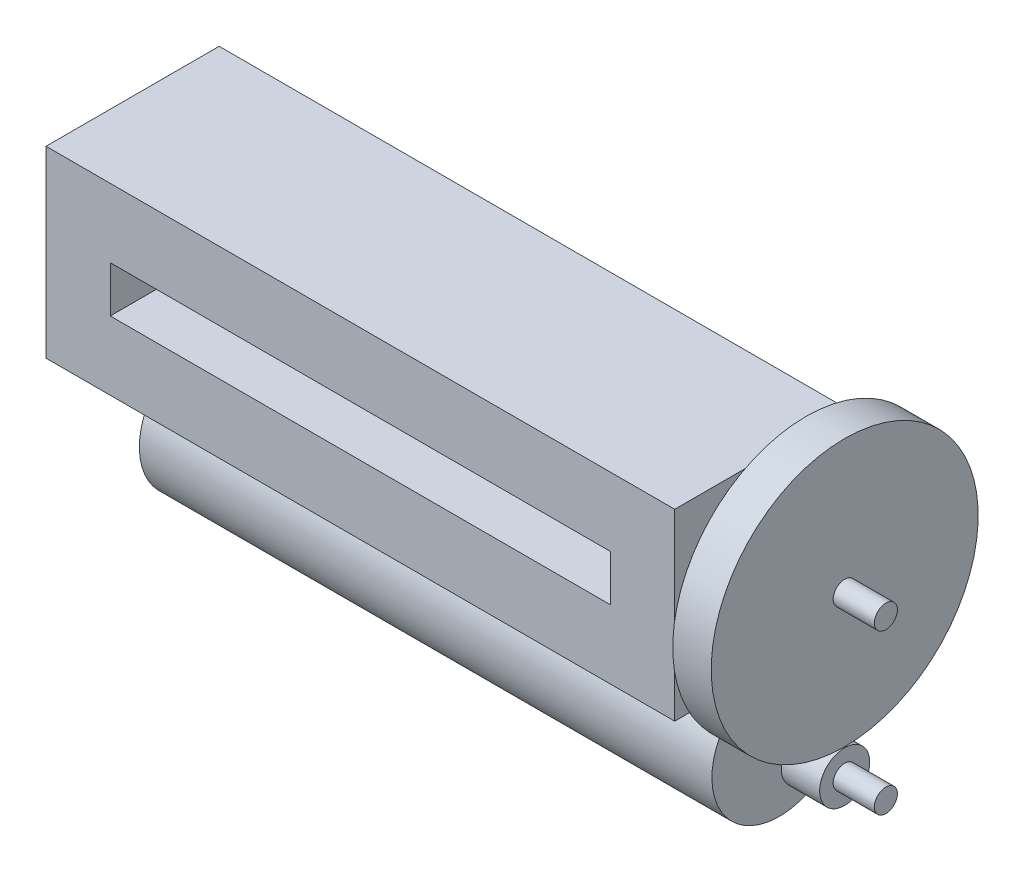
ISO-10303-21;
HEADER;
FILE_DESCRIPTION(('STEP AP214'),'2;1');
FILE_NAME('part.step','',(''),(''),'','','');
FILE_SCHEMA(('AUTOMOTIVE_DESIGN { 1 0 10303 214 1 1 1 1 }'));
ENDSEC;
DATA;
#1=APPLICATION_CONTEXT('core data for automotive mechanical design processes');
#2=APPLICATION_PROTOCOL_DEFINITION('international standard','automotive_design',2000,#1);
#3=PRODUCT_CONTEXT('',#1,'mechanical');
#4=PRODUCT('Part','Part','',(#3));
#5=PRODUCT_RELATED_PRODUCT_CATEGORY('part','',(#4));
#6=PRODUCT_DEFINITION_FORMATION('','',#4);
#7=PRODUCT_DEFINITION_CONTEXT('part definition',#1,'design');
#8=PRODUCT_DEFINITION('design','',#6,#7);
#9=PRODUCT_DEFINITION_SHAPE('','',#8);
#10=(LENGTH_UNIT() NAMED_UNIT(*) SI_UNIT(.MILLI.,.METRE.));
#11=(NAMED_UNIT(*) PLANE_ANGLE_UNIT() SI_UNIT($,.RADIAN.));
#12=(NAMED_UNIT(*) SI_UNIT($,.STERADIAN.) SOLID_ANGLE_UNIT());
#13=UNCERTAINTY_MEASURE_WITH_UNIT(LENGTH_MEASURE(1.E-05),#10,'distance_accuracy_value','');
#14=(GEOMETRIC_REPRESENTATION_CONTEXT(3) GLOBAL_UNCERTAINTY_ASSIGNED_CONTEXT((#13)) GLOBAL_UNIT_ASSIGNED_CONTEXT((#10,
#11,#12)) REPRESENTATION_CONTEXT('',''));
#15=CARTESIAN_POINT('',(0.,0.,0.));
#16=DIRECTION('',(0.,0.,1.));
#17=DIRECTION('',(1.,0.,0.));
#18=AXIS2_PLACEMENT_3D('',#15,#16,#17);
#19=CARTESIAN_POINT('',(-3.73,-14.1336074618737,3.05881386109098));
#20=DIRECTION('',(1.,0.,0.));
#21=DIRECTION('',(0.,1.,0.));
#22=AXIS2_PLACEMENT_3D('',#19,#20,#21);
#23=PLANE('',#22);
#24=CARTESIAN_POINT('',(-3.73,-13.8300074618737,3.36241386109098));
#25=DIRECTION('',(-1.,0.,0.));
#26=DIRECTION('',(0.,0.,1.));
#27=AXIS2_PLACEMENT_3D('',#24,#25,#26);
#28=CIRCLE('',#27,0.3);
#29=CARTESIAN_POINT('',(-3.73,-13.8300074618737,3.66241386109098));
#30=VERTEX_POINT('',#29);
#31=EDGE_CURVE('P0_E18',#30,#30,#28,.T.);
#32=ORIENTED_EDGE('',*,*,#31,.F.);
#33=EDGE_LOOP('',(#32));
#34=FACE_BOUND('',#33,.T.);
#35=ADVANCED_FACE('P0_F15',(#34),#23,.T.);
#36=CARTESIAN_POINT('',(-4.8,-13.8300074618737,3.36241386109098));
#37=DIRECTION('',(-1.,0.,0.));
#38=DIRECTION('',(0.,0.,1.));
#39=AXIS2_PLACEMENT_3D('',#36,#37,#38);
#40=CYLINDRICAL_SURFACE('',#39,0.3);
#41=CARTESIAN_POINT('',(-4.8,-13.8300074618737,3.36241386109098));
#42=DIRECTION('',(-1.,0.,0.));
#43=DIRECTION('',(0.,0.,1.));
#44=AXIS2_PLACEMENT_3D('',#41,#42,#43);
#45=CIRCLE('',#44,0.3);
#46=CARTESIAN_POINT('',(-4.8,-13.8300074618737,3.66241386109098));
#47=VERTEX_POINT('',#46);
#48=EDGE_CURVE('P0_E40',#47,#47,#45,.T.);
#49=ORIENTED_EDGE('',*,*,#48,.F.);
#50=EDGE_LOOP('',(#49));
#51=FACE_BOUND('',#50,.T.);
#52=ORIENTED_EDGE('',*,*,#31,.T.);
#53=EDGE_LOOP('',(#52));
#54=FACE_BOUND('',#53,.T.);
#55=ADVANCED_FACE('P0_F47',(#51,#54),#40,.T.);
#56=CARTESIAN_POINT('',(-4.8,-14.4878074618737,2.70461386109097));
#57=DIRECTION('',(1.,0.,0.));
#58=DIRECTION('',(0.,1.,0.));
#59=AXIS2_PLACEMENT_3D('',#56,#57,#58);
#60=PLANE('',#59);
#61=ORIENTED_EDGE('',*,*,#48,.T.);
#62=EDGE_LOOP('',(#61));
#63=FACE_BOUND('',#62,.T.);
#64=CARTESIAN_POINT('',(-4.8,-13.8300074618737,3.36241386109098));
#65=DIRECTION('',(1.,0.,0.));
#66=DIRECTION('',(0.,0.,-1.));
#67=AXIS2_PLACEMENT_3D('',#64,#65,#66);
#68=CIRCLE('',#67,0.650000000000001);
#69=CARTESIAN_POINT('',(-4.8,-13.8300074618737,2.71241386109098));
#70=VERTEX_POINT('',#69);
#71=EDGE_CURVE('P0_E38',#70,#70,#68,.F.);
#72=ORIENTED_EDGE('',*,*,#71,.F.);
#73=EDGE_LOOP('',(#72));
#74=FACE_BOUND('',#73,.T.);
#75=ADVANCED_FACE('P0_F54',(#63,#74),#60,.T.);
#76=CARTESIAN_POINT('',(-4.8,-13.8300074618737,3.36241386109098));
#77=DIRECTION('',(1.,0.,0.));
#78=DIRECTION('',(0.,0.,-1.));
#79=AXIS2_PLACEMENT_3D('',#76,#77,#78);
#80=CYLINDRICAL_SURFACE('',#79,0.650000000000001);
#81=CARTESIAN_POINT('',(-5.8,-13.8300074618737,3.36241386109098));
#82=DIRECTION('',(1.,0.,0.));
#83=DIRECTION('',(0.,0.,-1.));
#84=AXIS2_PLACEMENT_3D('',#81,#82,#83);
#85=CIRCLE('',#84,0.650000000000001);
#86=CARTESIAN_POINT('',(-5.8,-13.8300074618737,2.71241386109098));
#87=VERTEX_POINT('',#86);
#88=EDGE_CURVE('P0_E35',#87,#87,#85,.F.);
#89=ORIENTED_EDGE('',*,*,#88,.F.);
#90=EDGE_LOOP('',(#89));
#91=FACE_BOUND('',#90,.T.);
#92=ORIENTED_EDGE('',*,*,#71,.T.);
#93=EDGE_LOOP('',(#92));
#94=FACE_BOUND('',#93,.T.);
#95=ADVANCED_FACE('P0_F78',(#91,#94),#80,.T.);
#96=CARTESIAN_POINT('',(-21.3814522646421,-12.0590074618737,1.59141175307648));
#97=DIRECTION('',(-1.,0.,0.));
#98=DIRECTION('',(0.,-1.,0.));
#99=AXIS2_PLACEMENT_3D('',#96,#97,#98);
#100=PLANE('',#99);
#101=CARTESIAN_POINT('',(-21.3814522646421,-13.8300074618737,3.36241386109098));
#102=DIRECTION('',(1.,0.,0.));
#103=DIRECTION('',(0.,1.,0.));
#104=AXIS2_PLACEMENT_3D('',#101,#102,#103);
#105=CIRCLE('',#104,1.75);
#106=CARTESIAN_POINT('',(-21.3814522646422,-12.0800074618737,3.36241386109098));
#107=VERTEX_POINT('',#106);
#108=EDGE_CURVE('P0_E32',#107,#107,#105,.T.);
#109=ORIENTED_EDGE('',*,*,#108,.F.);
#110=EDGE_LOOP('',(#109));
#111=FACE_BOUND('',#110,.T.);
#112=ADVANCED_FACE('P0_F74',(#111),#100,.T.);
#113=CARTESIAN_POINT('',(-5.8,-13.1722074618737,2.70460964526328));
#114=DIRECTION('',(-1.,0.,0.));
#115=DIRECTION('',(0.,-1.,0.));
#116=AXIS2_PLACEMENT_3D('',#113,#114,#115);
#117=PLANE('',#116);
#118=CARTESIAN_POINT('',(-5.8,-13.8300074618737,3.36241386109098));
#119=DIRECTION('',(-1.,0.,0.));
#120=DIRECTION('',(0.,0.,1.));
#121=AXIS2_PLACEMENT_3D('',#118,#119,#120);
#122=CIRCLE('',#121,0.300000000000002);
#123=CARTESIAN_POINT('',(-5.8,-13.8300074618737,3.66241386109098));
#124=VERTEX_POINT('',#123);
#125=EDGE_CURVE('P0_E27',#124,#124,#122,.T.);
#126=ORIENTED_EDGE('',*,*,#125,.F.);
#127=EDGE_LOOP('',(#126));
#128=FACE_BOUND('',#127,.T.);
#129=ORIENTED_EDGE('',*,*,#88,.T.);
#130=EDGE_LOOP('',(#129));
#131=FACE_BOUND('',#130,.T.);
#132=ADVANCED_FACE('P0_F70',(#128,#131),#117,.T.);
#133=CARTESIAN_POINT('',(-6.5,-13.8300074618737,3.36241386109098));
#134=DIRECTION('',(1.,0.,0.));
#135=DIRECTION('',(0.,1.,0.));
#136=AXIS2_PLACEMENT_3D('',#133,#134,#135);
#137=CYLINDRICAL_SURFACE('',#136,1.75);
#138=CARTESIAN_POINT('',(-6.5,-13.8300074618737,3.36241386109098));
#139=DIRECTION('',(1.,0.,0.));
#140=DIRECTION('',(0.,1.,0.));
#141=AXIS2_PLACEMENT_3D('',#138,#139,#140);
#142=CIRCLE('',#141,1.75);
#143=CARTESIAN_POINT('',(-6.5,-12.0800074618737,3.36241386109098));
#144=VERTEX_POINT('',#143);
#145=EDGE_CURVE('P0_E22',#144,#144,#142,.T.);
#146=ORIENTED_EDGE('',*,*,#145,.F.);
#147=EDGE_LOOP('',(#146));
#148=FACE_BOUND('',#147,.T.);
#149=ORIENTED_EDGE('',*,*,#108,.T.);
#150=EDGE_LOOP('',(#149));
#151=FACE_BOUND('',#150,.T.);
#152=ADVANCED_FACE('P0_F63',(#148,#151),#137,.T.);
#153=CARTESIAN_POINT('',(-6.5,-13.8300074618737,3.36241386109098));
#154=DIRECTION('',(-1.,0.,0.));
#155=DIRECTION('',(0.,0.,1.));
#156=AXIS2_PLACEMENT_3D('',#153,#154,#155);
#157=CYLINDRICAL_SURFACE('',#156,0.300000000000002);
#158=CARTESIAN_POINT('',(-6.5,-13.8300074618737,3.36241386109098));
#159=DIRECTION('',(-1.,0.,0.));
#160=DIRECTION('',(0.,0.,1.));
#161=AXIS2_PLACEMENT_3D('',#158,#159,#160);
#162=CIRCLE('',#161,0.300000000000002);
#163=CARTESIAN_POINT('',(-6.5,-13.8300074618737,3.66241386109098));
#164=VERTEX_POINT('',#163);
#165=EDGE_CURVE('P0_E10',#164,#164,#162,.T.);
#166=ORIENTED_EDGE('',*,*,#165,.F.);
#167=EDGE_LOOP('',(#166));
#168=FACE_BOUND('',#167,.T.);
#169=ORIENTED_EDGE('',*,*,#125,.T.);
#170=EDGE_LOOP('',(#169));
#171=FACE_BOUND('',#170,.T.);
#172=ADVANCED_FACE('P0_F58',(#168,#171),#157,.T.);
#173=CARTESIAN_POINT('',(-6.5,-15.6010074618737,1.59141386109097));
#174=DIRECTION('',(1.,0.,0.));
#175=DIRECTION('',(0.,1.,0.));
#176=AXIS2_PLACEMENT_3D('',#173,#174,#175);
#177=PLANE('',#176);
#178=ORIENTED_EDGE('',*,*,#165,.T.);
#179=EDGE_LOOP('',(#178));
#180=FACE_BOUND('',#179,.T.);
#181=ORIENTED_EDGE('',*,*,#145,.T.);
#182=EDGE_LOOP('',(#181));
#183=FACE_BOUND('',#182,.T.);
#184=ADVANCED_FACE('P0_F56',(#180,#183),#177,.T.);
#185=CLOSED_SHELL('',(#35,#55,#75,#95,#112,#132,#152,#172,#184));
#186=MANIFOLD_SOLID_BREP('P0_B1',#185);
#187=CARTESIAN_POINT('',(-3.73,-9.99304444444445,3.05881386109098));
#188=DIRECTION('',(1.,0.,0.));
#189=DIRECTION('',(0.,1.,0.));
#190=AXIS2_PLACEMENT_3D('',#187,#188,#189);
#191=PLANE('',#190);
#192=CARTESIAN_POINT('',(-3.73,-9.68944444444445,3.36241386109098));
#193=DIRECTION('',(-1.,0.,0.));
#194=DIRECTION('',(0.,0.,1.));
#195=AXIS2_PLACEMENT_3D('',#192,#193,#194);
#196=CIRCLE('',#195,0.300000000000002);
#197=CARTESIAN_POINT('',(-3.73,-9.68944444444445,3.66241386109098));
#198=VERTEX_POINT('',#197);
#199=EDGE_CURVE('P1_E20',#198,#198,#196,.T.);
#200=ORIENTED_EDGE('',*,*,#199,.F.);
#201=EDGE_LOOP('',(#200));
#202=FACE_BOUND('',#201,.T.);
#203=ADVANCED_FACE('P1_F17',(#202),#191,.T.);
#204=CARTESIAN_POINT('',(-4.8,-9.68944444444445,3.36241386109098));
#205=DIRECTION('',(-1.,0.,0.));
#206=DIRECTION('',(0.,0.,1.));
#207=AXIS2_PLACEMENT_3D('',#204,#205,#206);
#208=CYLINDRICAL_SURFACE('',#207,0.300000000000002);
#209=CARTESIAN_POINT('',(-4.8,-9.68944444444445,3.36241386109098));
#210=DIRECTION('',(-1.,0.,0.));
#211=DIRECTION('',(0.,0.,1.));
#212=AXIS2_PLACEMENT_3D('',#209,#210,#211);
#213=CIRCLE('',#212,0.300000000000002);
#214=CARTESIAN_POINT('',(-4.8,-9.68944444444445,3.66241386109098));
#215=VERTEX_POINT('',#214);
#216=EDGE_CURVE('P1_E133',#215,#215,#213,.T.);
#217=ORIENTED_EDGE('',*,*,#216,.F.);
#218=EDGE_LOOP('',(#217));
#219=FACE_BOUND('',#218,.T.);
#220=ORIENTED_EDGE('',*,*,#199,.T.);
#221=EDGE_LOOP('',(#220));
#222=FACE_BOUND('',#221,.T.);
#223=ADVANCED_FACE('P1_F140',(#219,#222),#208,.T.);
#224=CARTESIAN_POINT('',(-4.8,-13.2000328612027,-0.148174555667285));
#225=DIRECTION('',(1.,0.,0.));
#226=DIRECTION('',(0.,1.,0.));
#227=AXIS2_PLACEMENT_3D('',#224,#225,#226);
#228=PLANE('',#227);
#229=ORIENTED_EDGE('',*,*,#216,.T.);
#230=EDGE_LOOP('',(#229));
#231=FACE_BOUND('',#230,.T.);
#232=CARTESIAN_POINT('',(-4.8,-9.68944444444445,3.36241386109098));
#233=DIRECTION('',(1.,0.,0.));
#234=DIRECTION('',(0.,1.,0.));
#235=AXIS2_PLACEMENT_3D('',#232,#233,#234);
#236=CIRCLE('',#235,3.46896088612476);
#237=CARTESIAN_POINT('',(-4.8,-6.22048355831969,3.36241386109098));
#238=VERTEX_POINT('',#237);
#239=EDGE_CURVE('P1_E131',#238,#238,#236,.F.);
#240=ORIENTED_EDGE('',*,*,#239,.F.);
#241=EDGE_LOOP('',(#240));
#242=FACE_BOUND('',#241,.T.);
#243=ADVANCED_FACE('P1_F147',(#231,#242),#228,.T.);
#244=CARTESIAN_POINT('',(-4.8,-9.68944444444445,3.36241386109098));
#245=DIRECTION('',(1.,0.,0.));
#246=DIRECTION('',(0.,1.,0.));
#247=AXIS2_PLACEMENT_3D('',#244,#245,#246);
#248=CYLINDRICAL_SURFACE('',#247,3.46896088612476);
#249=CARTESIAN_POINT('',(-5.8,-9.68944444444445,3.36241386109098));
#250=DIRECTION('',(1.,0.,0.));
#251=DIRECTION('',(0.,1.,0.));
#252=AXIS2_PLACEMENT_3D('',#249,#250,#251);
#253=CIRCLE('',#252,3.46896088612476);
#254=CARTESIAN_POINT('',(-5.8,-6.22048355831969,3.36241386109098));
#255=VERTEX_POINT('',#254);
#256=EDGE_CURVE('P1_E128',#255,#255,#253,.F.);
#257=ORIENTED_EDGE('',*,*,#256,.F.);
#258=EDGE_LOOP('',(#257));
#259=FACE_BOUND('',#258,.T.);
#260=ORIENTED_EDGE('',*,*,#239,.T.);
#261=EDGE_LOOP('',(#260));
#262=FACE_BOUND('',#261,.T.);
#263=ADVANCED_FACE('P1_F204',(#259,#262),#248,.T.);
#264=CARTESIAN_POINT('',(-5.8,-6.17885602768619,-0.148176663839935));
#265=DIRECTION('',(-1.,0.,0.));
#266=DIRECTION('',(0.,-1.,0.));
#267=AXIS2_PLACEMENT_3D('',#264,#265,#266);
#268=PLANE('',#267);
#269=CARTESIAN_POINT('',(-5.8,-9.68944444444445,3.36241386109098));
#270=DIRECTION('',(-1.,0.,0.));
#271=DIRECTION('',(0.,0.,1.));
#272=AXIS2_PLACEMENT_3D('',#269,#270,#271);
#273=CIRCLE('',#272,0.300000000000002);
#274=CARTESIAN_POINT('',(-5.8,-9.68944444444445,3.66241386109098));
#275=VERTEX_POINT('',#274);
#276=EDGE_CURVE('P1_E124',#275,#275,#273,.T.);
#277=ORIENTED_EDGE('',*,*,#276,.F.);
#278=EDGE_LOOP('',(#277));
#279=FACE_BOUND('',#278,.T.);
#280=ORIENTED_EDGE('',*,*,#256,.T.);
#281=EDGE_LOOP('',(#280));
#282=FACE_BOUND('',#281,.T.);
#283=ADVANCED_FACE('P1_F200',(#279,#282),#268,.T.);
#284=CARTESIAN_POINT('',(-6.5,-9.68944444444445,3.36241386109098));
#285=DIRECTION('',(-1.,0.,0.));
#286=DIRECTION('',(0.,0.,1.));
#287=AXIS2_PLACEMENT_3D('',#284,#285,#286);
#288=CYLINDRICAL_SURFACE('',#287,0.300000000000002);
#289=CARTESIAN_POINT('',(-6.5,-9.68944444444445,3.36241386109098));
#290=DIRECTION('',(-1.,0.,0.));
#291=DIRECTION('',(0.,0.,1.));
#292=AXIS2_PLACEMENT_3D('',#289,#290,#291);
#293=CIRCLE('',#292,0.300000000000002);
#294=CARTESIAN_POINT('',(-6.5,-9.68944444444445,3.66241386109098));
#295=VERTEX_POINT('',#294);
#296=EDGE_CURVE('P1_E119',#295,#295,#293,.T.);
#297=ORIENTED_EDGE('',*,*,#296,.F.);
#298=EDGE_LOOP('',(#297));
#299=FACE_BOUND('',#298,.T.);
#300=ORIENTED_EDGE('',*,*,#276,.T.);
#301=EDGE_LOOP('',(#300));
#302=FACE_BOUND('',#301,.T.);
#303=ADVANCED_FACE('P1_F196',(#299,#302),#288,.T.);
#304=CARTESIAN_POINT('',(-6.5,-12.0744444444444,1.58));
#305=DIRECTION('',(0.,0.,-1.));
#306=DIRECTION('',(-1.,0.,0.));
#307=AXIS2_PLACEMENT_3D('',#304,#305,#306);
#308=PLANE('',#307);
#309=DIRECTION('',(-1.,0.,0.));
#310=VECTOR('',#309,1.);
#311=CARTESIAN_POINT('',(-14.67,-7.30444444444445,1.58));
#312=LINE('',#311,#310);
#313=CARTESIAN_POINT('',(-6.5,-7.30444444444445,1.58));
#314=VERTEX_POINT('',#313);
#315=CARTESIAN_POINT('',(-22.84,-7.30444444444445,1.58));
#316=VERTEX_POINT('',#315);
#317=EDGE_CURVE('P1_E346',#314,#316,#312,.T.);
#318=ORIENTED_EDGE('',*,*,#317,.F.);
#319=DIRECTION('',(0.,1.,0.));
#320=VECTOR('',#319,1.);
#321=CARTESIAN_POINT('',(-6.5,-9.68944444444445,1.58));
#322=LINE('',#321,#320);
#323=CARTESIAN_POINT('',(-6.5,-12.0744444444444,1.58));
#324=VERTEX_POINT('',#323);
#325=EDGE_CURVE('P1_E123',#324,#314,#322,.T.);
#326=ORIENTED_EDGE('',*,*,#325,.F.);
#327=DIRECTION('',(1.,0.,0.));
#328=VECTOR('',#327,1.);
#329=CARTESIAN_POINT('',(-14.67,-12.0744444444444,1.58));
#330=LINE('',#329,#328);
#331=CARTESIAN_POINT('',(-22.84,-12.0744444444444,1.58));
#332=VERTEX_POINT('',#331);
#333=EDGE_CURVE('P1_E358',#332,#324,#330,.T.);
#334=ORIENTED_EDGE('',*,*,#333,.F.);
#335=DIRECTION('',(0.,-1.,0.));
#336=VECTOR('',#335,1.);
#337=CARTESIAN_POINT('',(-22.84,-9.68944444444445,1.58));
#338=LINE('',#337,#336);
#339=EDGE_CURVE('P1_E127',#316,#332,#338,.T.);
#340=ORIENTED_EDGE('',*,*,#339,.F.);
#341=EDGE_LOOP('',(#318,#326,#334,#340));
#342=FACE_BOUND('',#341,.T.);
#343=ADVANCED_FACE('P1_F192',(#342),#308,.T.);
#344=CARTESIAN_POINT('',(-22.84,-7.30444444444445,1.58));
#345=DIRECTION('',(-1.,0.,0.));
#346=DIRECTION('',(0.,-1.,0.));
#347=AXIS2_PLACEMENT_3D('',#344,#345,#346);
#348=PLANE('',#347);
#349=ORIENTED_EDGE('',*,*,#339,.T.);
#350=DIRECTION('',(0.,0.,1.));
#351=VECTOR('',#350,1.);
#352=CARTESIAN_POINT('',(-22.84,-12.0744444444444,1.58));
#353=LINE('',#352,#351);
#354=CARTESIAN_POINT('',(-22.84,-12.0744444444444,6.08));
#355=VERTEX_POINT('',#354);
#356=EDGE_CURVE('P1_E360',#355,#332,#353,.F.);
#357=ORIENTED_EDGE('',*,*,#356,.F.);
#358=DIRECTION('',(0.,1.,0.));
#359=VECTOR('',#358,1.);
#360=CARTESIAN_POINT('',(-22.84,-12.0744444444444,6.08));
#361=LINE('',#360,#359);
#362=CARTESIAN_POINT('',(-22.84,-7.30444444444445,6.08));
#363=VERTEX_POINT('',#362);
#364=EDGE_CURVE('P1_E364',#363,#355,#361,.F.);
#365=ORIENTED_EDGE('',*,*,#364,.F.);
#366=DIRECTION('',(0.,0.,1.));
#367=VECTOR('',#366,1.);
#368=CARTESIAN_POINT('',(-22.84,-7.30444444444445,1.58));
#369=LINE('',#368,#367);
#370=EDGE_CURVE('P1_E349',#316,#363,#369,.T.);
#371=ORIENTED_EDGE('',*,*,#370,.F.);
#372=EDGE_LOOP('',(#349,#357,#365,#371));
#373=FACE_BOUND('',#372,.T.);
#374=ADVANCED_FACE('P1_F188',(#373),#348,.T.);
#375=CARTESIAN_POINT('',(-22.84,-12.0744444444444,1.58));
#376=DIRECTION('',(0.,-1.,0.));
#377=DIRECTION('',(1.,0.,0.));
#378=AXIS2_PLACEMENT_3D('',#375,#376,#377);
#379=PLANE('',#378);
#380=ORIENTED_EDGE('',*,*,#333,.T.);
#381=DIRECTION('',(0.,0.,1.));
#382=VECTOR('',#381,1.);
#383=CARTESIAN_POINT('',(-6.5,-12.0744444444444,1.58));
#384=LINE('',#383,#382);
#385=CARTESIAN_POINT('',(-6.5,-12.0744444444444,6.08));
#386=VERTEX_POINT('',#385);
#387=EDGE_CURVE('P1_E342',#386,#324,#384,.F.);
#388=ORIENTED_EDGE('',*,*,#387,.F.);
#389=DIRECTION('',(1.,0.,0.));
#390=VECTOR('',#389,1.);
#391=CARTESIAN_POINT('',(-14.67,-12.0744444444444,6.08));
#392=LINE('',#391,#390);
#393=EDGE_CURVE('P1_E368',#355,#386,#392,.T.);
#394=ORIENTED_EDGE('',*,*,#393,.F.);
#395=ORIENTED_EDGE('',*,*,#356,.T.);
#396=EDGE_LOOP('',(#380,#388,#394,#395));
#397=FACE_BOUND('',#396,.T.);
#398=ADVANCED_FACE('P1_F184',(#397),#379,.T.);
#399=CARTESIAN_POINT('',(-6.5,-12.0744444444444,1.58));
#400=DIRECTION('',(1.,0.,0.));
#401=DIRECTION('',(0.,1.,0.));
#402=AXIS2_PLACEMENT_3D('',#399,#400,#401);
#403=PLANE('',#402);
#404=ORIENTED_EDGE('',*,*,#296,.T.);
#405=EDGE_LOOP('',(#404));
#406=FACE_BOUND('',#405,.T.);
#407=ORIENTED_EDGE('',*,*,#325,.T.);
#408=DIRECTION('',(0.,0.,1.));
#409=VECTOR('',#408,1.);
#410=CARTESIAN_POINT('',(-6.5,-7.30444444444445,1.58));
#411=LINE('',#410,#409);
#412=CARTESIAN_POINT('',(-6.5,-7.30444444444445,6.08));
#413=VERTEX_POINT('',#412);
#414=EDGE_CURVE('P1_E122',#413,#314,#411,.F.);
#415=ORIENTED_EDGE('',*,*,#414,.F.);
#416=DIRECTION('',(0.,1.,0.));
#417=VECTOR('',#416,1.);
#418=CARTESIAN_POINT('',(-6.5,-12.0744444444444,6.08));
#419=LINE('',#418,#417);
#420=EDGE_CURVE('P1_E413',#386,#413,#419,.T.);
#421=ORIENTED_EDGE('',*,*,#420,.F.);
#422=ORIENTED_EDGE('',*,*,#387,.T.);
#423=EDGE_LOOP('',(#407,#415,#421,#422));
#424=FACE_BOUND('',#423,.T.);
#425=ADVANCED_FACE('P1_F180',(#406,#424),#403,.T.);
#426=CARTESIAN_POINT('',(-6.5,-7.30444444444445,1.58));
#427=DIRECTION('',(0.,1.,0.));
#428=DIRECTION('',(-1.,0.,0.));
#429=AXIS2_PLACEMENT_3D('',#426,#427,#428);
#430=PLANE('',#429);
#431=ORIENTED_EDGE('',*,*,#317,.T.);
#432=ORIENTED_EDGE('',*,*,#370,.T.);
#433=DIRECTION('',(-1.,0.,0.));
#434=VECTOR('',#433,1.);
#435=CARTESIAN_POINT('',(-14.67,-7.30444444444445,6.08));
#436=LINE('',#435,#434);
#437=EDGE_CURVE('P1_E352',#413,#363,#436,.T.);
#438=ORIENTED_EDGE('',*,*,#437,.F.);
#439=ORIENTED_EDGE('',*,*,#414,.T.);
#440=EDGE_LOOP('',(#431,#432,#438,#439));
#441=FACE_BOUND('',#440,.T.);
#442=ADVANCED_FACE('P1_F176',(#441),#430,.T.);
#443=CARTESIAN_POINT('',(-21.17,-10.2894444444444,6.08));
#444=DIRECTION('',(0.,1.,0.));
#445=DIRECTION('',(1.,0.,0.));
#446=AXIS2_PLACEMENT_3D('',#443,#444,#445);
#447=PLANE('',#446);
#448=DIRECTION('',(-1.,0.,0.));
#449=VECTOR('',#448,1.);
#450=CARTESIAN_POINT('',(-14.67,-10.2894444444444,6.08));
#451=LINE('',#450,#449);
#452=CARTESIAN_POINT('',(-8.16999999999999,-10.2894444444444,6.08));
#453=VERTEX_POINT('',#452);
#454=CARTESIAN_POINT('',(-21.17,-10.2894444444444,6.08));
#455=VERTEX_POINT('',#454);
#456=EDGE_CURVE('P1_E107',#453,#455,#451,.T.);
#457=ORIENTED_EDGE('',*,*,#456,.F.);
#458=DIRECTION('',(0.,0.,-1.));
#459=VECTOR('',#458,1.);
#460=CARTESIAN_POINT('',(-8.17,-10.2894444444445,6.08));
#461=LINE('',#460,#459);
#462=CARTESIAN_POINT('',(-8.17,-10.2894444444445,3.30222222222222));
#463=VERTEX_POINT('',#462);
#464=EDGE_CURVE('P1_E365',#463,#453,#461,.F.);
#465=ORIENTED_EDGE('',*,*,#464,.F.);
#466=DIRECTION('',(1.,0.,0.));
#467=VECTOR('',#466,1.);
#468=CARTESIAN_POINT('',(-14.67,-10.2894444444445,3.30222222222222));
#469=LINE('',#468,#467);
#470=CARTESIAN_POINT('',(-21.17,-10.2894444444445,3.30222222222222));
#471=VERTEX_POINT('',#470);
#472=EDGE_CURVE('P1_E374',#471,#463,#469,.T.);
#473=ORIENTED_EDGE('',*,*,#472,.F.);
#474=DIRECTION('',(0.,0.,-1.));
#475=VECTOR('',#474,1.);
#476=CARTESIAN_POINT('',(-21.17,-10.2894444444445,6.08));
#477=LINE('',#476,#475);
#478=EDGE_CURVE('P1_E115',#455,#471,#477,.T.);
#479=ORIENTED_EDGE('',*,*,#478,.F.);
#480=EDGE_LOOP('',(#457,#465,#473,#479));
#481=FACE_BOUND('',#480,.T.);
#482=ADVANCED_FACE('P1_F172',(#481),#447,.T.);
#483=CARTESIAN_POINT('',(-8.17,-9.98334403037524,3.30222222222222));
#484=DIRECTION('',(0.,0.,1.));
#485=DIRECTION('',(-1.,0.,0.));
#486=AXIS2_PLACEMENT_3D('',#483,#484,#485);
#487=PLANE('',#486);
#488=ORIENTED_EDGE('',*,*,#472,.T.);
#489=DIRECTION('',(0.,-1.,0.));
#490=VECTOR('',#489,1.);
#491=CARTESIAN_POINT('',(-8.17,-9.68944444444446,3.30222222222222));
#492=LINE('',#491,#490);
#493=CARTESIAN_POINT('',(-8.17,-9.98334403037525,3.30222222222222));
#494=VERTEX_POINT('',#493);
#495=EDGE_CURVE('P1_E370',#494,#463,#492,.T.);
#496=ORIENTED_EDGE('',*,*,#495,.F.);
#497=DIRECTION('',(1.,0.,0.));
#498=VECTOR('',#497,1.);
#499=CARTESIAN_POINT('',(-14.67,-9.98334403037524,3.30222222222222));
#500=LINE('',#499,#498);
#501=CARTESIAN_POINT('',(-21.17,-9.98334403037525,3.30222222222222));
#502=VERTEX_POINT('',#501);
#503=EDGE_CURVE('P1_E97',#502,#494,#500,.T.);
#504=ORIENTED_EDGE('',*,*,#503,.F.);
#505=DIRECTION('',(0.,1.,0.));
#506=VECTOR('',#505,1.);
#507=CARTESIAN_POINT('',(-21.17,-9.68944444444446,3.30222222222222));
#508=LINE('',#507,#506);
#509=EDGE_CURVE('P1_E93',#471,#502,#508,.T.);
#510=ORIENTED_EDGE('',*,*,#509,.F.);
#511=EDGE_LOOP('',(#488,#496,#504,#510));
#512=FACE_BOUND('',#511,.T.);
#513=ADVANCED_FACE('P1_F169',(#512),#487,.T.);
#514=CARTESIAN_POINT('',(-8.17,-10.2894444444445,6.08));
#515=DIRECTION('',(-1.,0.,0.));
#516=DIRECTION('',(0.,1.,0.));
#517=AXIS2_PLACEMENT_3D('',#514,#515,#516);
#518=PLANE('',#517);
#519=DIRECTION('',(0.,0.,-1.));
#520=VECTOR('',#519,1.);
#521=CARTESIAN_POINT('',(-8.17,-9.08944444444445,6.08));
#522=LINE('',#521,#520);
#523=CARTESIAN_POINT('',(-8.17,-9.08944444444446,3.30222222222222));
#524=VERTEX_POINT('',#523);
#525=CARTESIAN_POINT('',(-8.16999999999999,-9.08944444444445,6.08));
#526=VERTEX_POINT('',#525);
#527=EDGE_CURVE('P1_E382',#524,#526,#522,.F.);
#528=ORIENTED_EDGE('',*,*,#527,.F.);
#529=DIRECTION('',(0.,-1.,0.));
#530=VECTOR('',#529,1.);
#531=CARTESIAN_POINT('',(-8.17,-9.68944444444446,3.30222222222222));
#532=LINE('',#531,#530);
#533=CARTESIAN_POINT('',(-8.17,-9.39554485851365,3.30222222222222));
#534=VERTEX_POINT('',#533);
#535=EDGE_CURVE('P1_E363',#524,#534,#532,.T.);
#536=ORIENTED_EDGE('',*,*,#535,.T.);
#537=CARTESIAN_POINT('',(-8.17,-9.68944444444445,3.36241386109098));
#538=DIRECTION('',(-1.,0.,0.));
#539=DIRECTION('',(0.,0.,1.));
#540=AXIS2_PLACEMENT_3D('',#537,#538,#539);
#541=CIRCLE('',#540,0.300000000000004);
#542=EDGE_CURVE('P1_E98',#494,#534,#541,.T.);
#543=ORIENTED_EDGE('',*,*,#542,.F.);
#544=ORIENTED_EDGE('',*,*,#495,.T.);
#545=ORIENTED_EDGE('',*,*,#464,.T.);
#546=DIRECTION('',(0.,1.,0.));
#547=VECTOR('',#546,1.);
#548=CARTESIAN_POINT('',(-8.16999999999998,-12.0744444444444,6.08));
#549=LINE('',#548,#547);
#550=EDGE_CURVE('P1_E401',#526,#453,#549,.F.);
#551=ORIENTED_EDGE('',*,*,#550,.F.);
#552=EDGE_LOOP('',(#528,#536,#543,#544,#545,#551));
#553=FACE_BOUND('',#552,.T.);
#554=ADVANCED_FACE('P1_F165',(#553),#518,.T.);
#555=CARTESIAN_POINT('',(-22.84,-12.0744444444444,6.08));
#556=DIRECTION('',(0.,0.,1.));
#557=DIRECTION('',(1.,0.,0.));
#558=AXIS2_PLACEMENT_3D('',#555,#556,#557);
#559=PLANE('',#558);
#560=ORIENTED_EDGE('',*,*,#550,.T.);
#561=ORIENTED_EDGE('',*,*,#456,.T.);
#562=DIRECTION('',(0.,-1.,0.));
#563=VECTOR('',#562,1.);
#564=CARTESIAN_POINT('',(-21.17,-9.68944444444445,6.08));
#565=LINE('',#564,#563);
#566=CARTESIAN_POINT('',(-21.17,-9.08944444444445,6.08));
#567=VERTEX_POINT('',#566);
#568=EDGE_CURVE('P1_E106',#567,#455,#565,.T.);
#569=ORIENTED_EDGE('',*,*,#568,.F.);
#570=DIRECTION('',(-1.,0.,0.));
#571=VECTOR('',#570,1.);
#572=CARTESIAN_POINT('',(-14.67,-9.08944444444445,6.08));
#573=LINE('',#572,#571);
#574=EDGE_CURVE('P1_E385',#526,#567,#573,.T.);
#575=ORIENTED_EDGE('',*,*,#574,.F.);
#576=EDGE_LOOP('',(#560,#561,#569,#575));
#577=FACE_BOUND('',#576,.T.);
#578=ORIENTED_EDGE('',*,*,#420,.T.);
#579=ORIENTED_EDGE('',*,*,#437,.T.);
#580=ORIENTED_EDGE('',*,*,#364,.T.);
#581=ORIENTED_EDGE('',*,*,#393,.T.);
#582=EDGE_LOOP('',(#578,#579,#580,#581));
#583=FACE_BOUND('',#582,.T.);
#584=ADVANCED_FACE('P1_F162',(#577,#583),#559,.T.);
#585=CARTESIAN_POINT('',(-21.17,-9.08944444444445,6.08));
#586=DIRECTION('',(1.,0.,0.));
#587=DIRECTION('',(0.,-1.,0.));
#588=AXIS2_PLACEMENT_3D('',#585,#586,#587);
#589=PLANE('',#588);
#590=ORIENTED_EDGE('',*,*,#478,.T.);
#591=ORIENTED_EDGE('',*,*,#509,.T.);
#592=CARTESIAN_POINT('',(-21.17,-9.68944444444445,3.36241386109098));
#593=DIRECTION('',(-1.,0.,0.));
#594=DIRECTION('',(0.,0.,1.));
#595=AXIS2_PLACEMENT_3D('',#592,#593,#594);
#596=CIRCLE('',#595,0.300000000000004);
#597=CARTESIAN_POINT('',(-21.17,-9.39554485851365,3.30222222222222));
#598=VERTEX_POINT('',#597);
#599=EDGE_CURVE('P1_E89',#598,#502,#596,.F.);
#600=ORIENTED_EDGE('',*,*,#599,.F.);
#601=DIRECTION('',(0.,1.,0.));
#602=VECTOR('',#601,1.);
#603=CARTESIAN_POINT('',(-21.17,-9.68944444444446,3.30222222222222));
#604=LINE('',#603,#602);
#605=CARTESIAN_POINT('',(-21.17,-9.08944444444446,3.30222222222222));
#606=VERTEX_POINT('',#605);
#607=EDGE_CURVE('P1_E35',#598,#606,#604,.T.);
#608=ORIENTED_EDGE('',*,*,#607,.T.);
#609=DIRECTION('',(0.,0.,-1.));
#610=VECTOR('',#609,1.);
#611=CARTESIAN_POINT('',(-21.17,-9.08944444444445,6.08));
#612=LINE('',#611,#610);
#613=EDGE_CURVE('P1_E404',#567,#606,#612,.T.);
#614=ORIENTED_EDGE('',*,*,#613,.F.);
#615=ORIENTED_EDGE('',*,*,#568,.T.);
#616=EDGE_LOOP('',(#590,#591,#600,#608,#614,#615));
#617=FACE_BOUND('',#616,.T.);
#618=ADVANCED_FACE('P1_F91',(#617),#589,.T.);
#619=CARTESIAN_POINT('',(-8.17,-9.08944444444445,6.08));
#620=DIRECTION('',(0.,-1.,0.));
#621=DIRECTION('',(-1.,0.,0.));
#622=AXIS2_PLACEMENT_3D('',#619,#620,#621);
#623=PLANE('',#622);
#624=ORIENTED_EDGE('',*,*,#574,.T.);
#625=ORIENTED_EDGE('',*,*,#613,.T.);
#626=DIRECTION('',(-1.,0.,0.));
#627=VECTOR('',#626,1.);
#628=CARTESIAN_POINT('',(-14.67,-9.08944444444446,3.30222222222221));
#629=LINE('',#628,#627);
#630=EDGE_CURVE('P1_E26',#524,#606,#629,.T.);
#631=ORIENTED_EDGE('',*,*,#630,.F.);
#632=ORIENTED_EDGE('',*,*,#527,.T.);
#633=EDGE_LOOP('',(#624,#625,#631,#632));
#634=FACE_BOUND('',#633,.T.);
#635=ADVANCED_FACE('P1_F154',(#634),#623,.T.);
#636=CARTESIAN_POINT('',(-8.17,-9.08944444444446,3.30222222222221));
#637=DIRECTION('',(0.,0.,1.));
#638=DIRECTION('',(-1.,0.,0.));
#639=AXIS2_PLACEMENT_3D('',#636,#637,#638);
#640=PLANE('',#639);
#641=ORIENTED_EDGE('',*,*,#630,.T.);
#642=ORIENTED_EDGE('',*,*,#607,.F.);
#643=DIRECTION('',(-1.,0.,0.));
#644=VECTOR('',#643,1.);
#645=CARTESIAN_POINT('',(-14.67,-9.39554485851365,3.30222222222222));
#646=LINE('',#645,#644);
#647=EDGE_CURVE('P1_E11',#534,#598,#646,.T.);
#648=ORIENTED_EDGE('',*,*,#647,.F.);
#649=ORIENTED_EDGE('',*,*,#535,.F.);
#650=EDGE_LOOP('',(#641,#642,#648,#649));
#651=FACE_BOUND('',#650,.T.);
#652=ADVANCED_FACE('P1_F103',(#651),#640,.T.);
#653=CARTESIAN_POINT('',(-21.17,-9.68944444444445,3.36241386109098));
#654=DIRECTION('',(-1.,0.,0.));
#655=DIRECTION('',(0.,0.,1.));
#656=AXIS2_PLACEMENT_3D('',#653,#654,#655);
#657=CYLINDRICAL_SURFACE('',#656,0.300000000000004);
#658=ORIENTED_EDGE('',*,*,#647,.T.);
#659=ORIENTED_EDGE('',*,*,#599,.T.);
#660=ORIENTED_EDGE('',*,*,#503,.T.);
#661=ORIENTED_EDGE('',*,*,#542,.T.);
#662=EDGE_LOOP('',(#658,#659,#660,#661));
#663=FACE_BOUND('',#662,.T.);
#664=ADVANCED_FACE('P1_F110',(#663),#657,.T.);
#665=CLOSED_SHELL('',(#203,#223,#243,#263,#283,#303,#343,#374,#398,#425,#442,#482,#513,#554,
#584,#618,#635,#652,#664));
#666=MANIFOLD_SOLID_BREP('P1_B1',#665);
#667=ADVANCED_BREP_SHAPE_REPRESENTATION('',(#18,#186,#666),#14);
#668=SHAPE_DEFINITION_REPRESENTATION(#9,#667);
ENDSEC;
END-ISO-10303-21;
